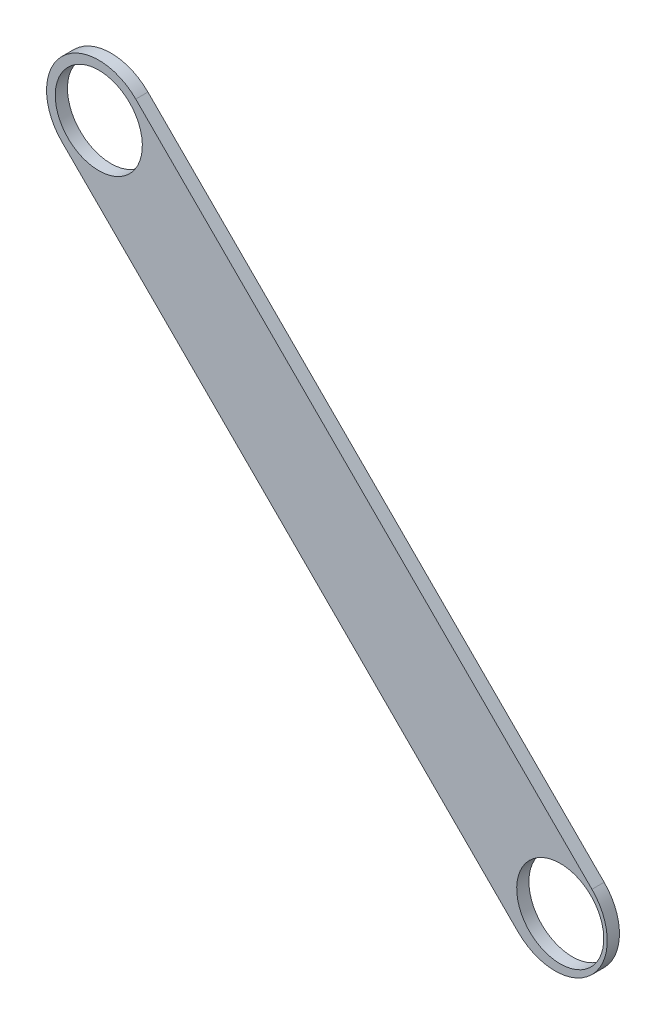
ISO-10303-21;
HEADER;
FILE_DESCRIPTION(('STEP AP214'),'2;1');
FILE_NAME('part.step','',(''),(''),'','','');
FILE_SCHEMA(('AUTOMOTIVE_DESIGN { 1 0 10303 214 1 1 1 1 }'));
ENDSEC;
DATA;
#1=APPLICATION_CONTEXT('core data for automotive mechanical design processes');
#2=APPLICATION_PROTOCOL_DEFINITION('international standard','automotive_design',2000,#1);
#3=PRODUCT_CONTEXT('',#1,'mechanical');
#4=PRODUCT('Part','Part','',(#3));
#5=PRODUCT_RELATED_PRODUCT_CATEGORY('part','',(#4));
#6=PRODUCT_DEFINITION_FORMATION('','',#4);
#7=PRODUCT_DEFINITION_CONTEXT('part definition',#1,'design');
#8=PRODUCT_DEFINITION('design','',#6,#7);
#9=PRODUCT_DEFINITION_SHAPE('','',#8);
#10=(LENGTH_UNIT() NAMED_UNIT(*) SI_UNIT(.MILLI.,.METRE.));
#11=(NAMED_UNIT(*) PLANE_ANGLE_UNIT() SI_UNIT($,.RADIAN.));
#12=(NAMED_UNIT(*) SI_UNIT($,.STERADIAN.) SOLID_ANGLE_UNIT());
#13=UNCERTAINTY_MEASURE_WITH_UNIT(LENGTH_MEASURE(1.E-05),#10,'distance_accuracy_value','');
#14=(GEOMETRIC_REPRESENTATION_CONTEXT(3) GLOBAL_UNCERTAINTY_ASSIGNED_CONTEXT((#13)) GLOBAL_UNIT_ASSIGNED_CONTEXT((#10,
#11,#12)) REPRESENTATION_CONTEXT('',''));
#15=CARTESIAN_POINT('',(0.,0.,0.));
#16=DIRECTION('',(0.,0.,1.));
#17=DIRECTION('',(1.,0.,0.));
#18=AXIS2_PLACEMENT_3D('',#15,#16,#17);
#19=CARTESIAN_POINT('',(89.575,-131.37,-0.045));
#20=DIRECTION('',(0.,0.,-1.));
#21=DIRECTION('',(0.,-1.,0.));
#22=AXIS2_PLACEMENT_3D('',#19,#20,#21);
#23=CYLINDRICAL_SURFACE('',#22,0.125);
#24=CARTESIAN_POINT('',(89.575,-131.37,-0.035));
#25=DIRECTION('',(0.,0.,-1.));
#26=DIRECTION('',(0.,-1.,0.));
#27=AXIS2_PLACEMENT_3D('',#24,#25,#26);
#28=CIRCLE('',#27,0.125);
#29=CARTESIAN_POINT('',(89.575,-131.495,-0.035));
#30=VERTEX_POINT('',#29);
#31=EDGE_CURVE('E128',#30,#30,#28,.T.);
#32=ORIENTED_EDGE('',*,*,#31,.T.);
#33=DIRECTION('',(0.,0.,1.));
#34=VECTOR('',#33,1.);
#35=CARTESIAN_POINT('',(89.575,-131.495,-0.045));
#36=LINE('',#35,#34);
#37=CARTESIAN_POINT('',(89.575,-131.495,0.));
#38=VERTEX_POINT('',#37);
#39=EDGE_CURVE('E11',#30,#38,#36,.T.);
#40=ORIENTED_EDGE('',*,*,#39,.T.);
#41=CARTESIAN_POINT('',(89.575,-131.37,0.));
#42=DIRECTION('',(0.,0.,-1.));
#43=DIRECTION('',(0.,-1.,0.));
#44=AXIS2_PLACEMENT_3D('',#41,#42,#43);
#45=CIRCLE('',#44,0.125);
#46=EDGE_CURVE('E141',#38,#38,#45,.T.);
#47=ORIENTED_EDGE('',*,*,#46,.F.);
#48=ORIENTED_EDGE('',*,*,#39,.F.);
#49=EDGE_LOOP('',(#32,#40,#47,#48));
#50=FACE_BOUND('',#49,.T.);
#51=ADVANCED_FACE('F17',(#50),#23,.F.);
#52=CARTESIAN_POINT('',(90.9,-132.68,-0.045));
#53=DIRECTION('',(0.,0.,-1.));
#54=DIRECTION('',(0.,-1.,0.));
#55=AXIS2_PLACEMENT_3D('',#52,#53,#54);
#56=CYLINDRICAL_SURFACE('',#55,0.125);
#57=CARTESIAN_POINT('',(90.9,-132.68,-0.035));
#58=DIRECTION('',(0.,0.,-1.));
#59=DIRECTION('',(0.,-1.,0.));
#60=AXIS2_PLACEMENT_3D('',#57,#58,#59);
#61=CIRCLE('',#60,0.125);
#62=CARTESIAN_POINT('',(90.9,-132.805,-0.035));
#63=VERTEX_POINT('',#62);
#64=EDGE_CURVE('E145',#63,#63,#61,.T.);
#65=ORIENTED_EDGE('',*,*,#64,.T.);
#66=DIRECTION('',(0.,0.,1.));
#67=VECTOR('',#66,1.);
#68=CARTESIAN_POINT('',(90.9,-132.805,-0.045));
#69=LINE('',#68,#67);
#70=CARTESIAN_POINT('',(90.9,-132.805,0.));
#71=VERTEX_POINT('',#70);
#72=EDGE_CURVE('E25',#63,#71,#69,.T.);
#73=ORIENTED_EDGE('',*,*,#72,.T.);
#74=CARTESIAN_POINT('',(90.9,-132.68,0.));
#75=DIRECTION('',(0.,0.,-1.));
#76=DIRECTION('',(0.,-1.,0.));
#77=AXIS2_PLACEMENT_3D('',#74,#75,#76);
#78=CIRCLE('',#77,0.125);
#79=EDGE_CURVE('E127',#71,#71,#78,.T.);
#80=ORIENTED_EDGE('',*,*,#79,.F.);
#81=ORIENTED_EDGE('',*,*,#72,.F.);
#82=EDGE_LOOP('',(#65,#73,#80,#81));
#83=FACE_BOUND('',#82,.T.);
#84=ADVANCED_FACE('F220',(#83),#56,.F.);
#85=CARTESIAN_POINT('',(89.468933,-131.476066,-0.035));
#86=DIRECTION('',(0.707106781186548,0.707106781186548,0.));
#87=DIRECTION('',(0.,0.,-1.));
#88=AXIS2_PLACEMENT_3D('',#85,#86,#87);
#89=PLANE('',#88);
#90=DIRECTION('',(0.707106781186548,-0.707106781186548,0.));
#91=VECTOR('',#90,1.);
#92=CARTESIAN_POINT('',(89.468933,-131.476066,-0.035));
#93=LINE('',#92,#91);
#94=CARTESIAN_POINT('',(89.468933,-131.476066,-0.035));
#95=VERTEX_POINT('',#94);
#96=CARTESIAN_POINT('',(90.778933,-132.786066,-0.035));
#97=VERTEX_POINT('',#96);
#98=EDGE_CURVE('E148',#95,#97,#93,.T.);
#99=ORIENTED_EDGE('',*,*,#98,.T.);
#100=DIRECTION('',(0.,0.,1.));
#101=VECTOR('',#100,1.);
#102=CARTESIAN_POINT('',(90.778933,-132.786066,-0.035));
#103=LINE('',#102,#101);
#104=CARTESIAN_POINT('',(90.778933,-132.786066,0.));
#105=VERTEX_POINT('',#104);
#106=EDGE_CURVE('E95',#97,#105,#103,.T.);
#107=ORIENTED_EDGE('',*,*,#106,.T.);
#108=DIRECTION('',(0.707106781186548,-0.707106781186548,0.));
#109=VECTOR('',#108,1.);
#110=CARTESIAN_POINT('',(89.468933,-131.476066,0.));
#111=LINE('',#110,#109);
#112=CARTESIAN_POINT('',(89.468933,-131.476066,0.));
#113=VERTEX_POINT('',#112);
#114=EDGE_CURVE('E125',#113,#105,#111,.T.);
#115=ORIENTED_EDGE('',*,*,#114,.F.);
#116=DIRECTION('',(0.,0.,1.));
#117=VECTOR('',#116,1.);
#118=CARTESIAN_POINT('',(89.468933,-131.476066,-0.035));
#119=LINE('',#118,#117);
#120=EDGE_CURVE('E136',#95,#113,#119,.T.);
#121=ORIENTED_EDGE('',*,*,#120,.F.);
#122=EDGE_LOOP('',(#99,#107,#115,#121));
#123=FACE_BOUND('',#122,.T.);
#124=ADVANCED_FACE('F218',(#123),#89,.F.);
#125=CARTESIAN_POINT('',(90.991066,-132.573933,0.));
#126=DIRECTION('',(0.,0.,1.));
#127=DIRECTION('',(1.,0.,0.));
#128=AXIS2_PLACEMENT_3D('',#125,#126,#127);
#129=PLANE('',#128);
#130=ORIENTED_EDGE('',*,*,#46,.T.);
#131=EDGE_LOOP('',(#130));
#132=FACE_BOUND('',#131,.T.);
#133=ORIENTED_EDGE('',*,*,#79,.T.);
#134=EDGE_LOOP('',(#133));
#135=FACE_BOUND('',#134,.T.);
#136=DIRECTION('',(-0.707106781186548,0.707106781186548,0.));
#137=VECTOR('',#136,1.);
#138=CARTESIAN_POINT('',(90.991066,-132.573933,0.));
#139=LINE('',#138,#137);
#140=CARTESIAN_POINT('',(90.991066,-132.573933,0.));
#141=VERTEX_POINT('',#140);
#142=CARTESIAN_POINT('',(89.681066,-131.263933,0.));
#143=VERTEX_POINT('',#142);
#144=EDGE_CURVE('E107',#141,#143,#139,.T.);
#145=ORIENTED_EDGE('',*,*,#144,.T.);
#146=CARTESIAN_POINT('',(89.5749995,-131.3699995,0.));
#147=DIRECTION('',(0.,0.,1.));
#148=DIRECTION('',(0.707106781186548,0.707106781186548,0.));
#149=AXIS2_PLACEMENT_3D('',#146,#147,#148);
#150=CIRCLE('',#149,0.150000682813);
#151=EDGE_CURVE('E124',#143,#113,#150,.T.);
#152=ORIENTED_EDGE('',*,*,#151,.T.);
#153=ORIENTED_EDGE('',*,*,#114,.T.);
#154=CARTESIAN_POINT('',(90.8849995,-132.6799995,0.));
#155=DIRECTION('',(0.,0.,1.));
#156=DIRECTION('',(-0.707106781186548,-0.707106781186548,0.));
#157=AXIS2_PLACEMENT_3D('',#154,#155,#156);
#158=CIRCLE('',#157,0.150000682813);
#159=EDGE_CURVE('E99',#105,#141,#158,.T.);
#160=ORIENTED_EDGE('',*,*,#159,.T.);
#161=EDGE_LOOP('',(#145,#152,#153,#160));
#162=FACE_BOUND('',#161,.T.);
#163=ADVANCED_FACE('F213',(#132,#135,#162),#129,.T.);
#164=CARTESIAN_POINT('',(90.991066,-132.573933,-0.035));
#165=DIRECTION('',(0.,0.,1.));
#166=DIRECTION('',(1.,0.,0.));
#167=AXIS2_PLACEMENT_3D('',#164,#165,#166);
#168=PLANE('',#167);
#169=ORIENTED_EDGE('',*,*,#31,.F.);
#170=EDGE_LOOP('',(#169));
#171=FACE_BOUND('',#170,.T.);
#172=ORIENTED_EDGE('',*,*,#64,.F.);
#173=EDGE_LOOP('',(#172));
#174=FACE_BOUND('',#173,.T.);
#175=CARTESIAN_POINT('',(90.8849995,-132.6799995,-0.035));
#176=DIRECTION('',(0.,0.,1.));
#177=DIRECTION('',(-0.707106781186548,-0.707106781186548,0.));
#178=AXIS2_PLACEMENT_3D('',#175,#176,#177);
#179=CIRCLE('',#178,0.150000682813);
#180=CARTESIAN_POINT('',(90.991066,-132.573933,-0.035));
#181=VERTEX_POINT('',#180);
#182=EDGE_CURVE('E88',#97,#181,#179,.T.);
#183=ORIENTED_EDGE('',*,*,#182,.F.);
#184=ORIENTED_EDGE('',*,*,#98,.F.);
#185=CARTESIAN_POINT('',(89.5749995,-131.3699995,-0.035));
#186=DIRECTION('',(0.,0.,1.));
#187=DIRECTION('',(0.707106781186548,0.707106781186548,0.));
#188=AXIS2_PLACEMENT_3D('',#185,#186,#187);
#189=CIRCLE('',#188,0.150000682813);
#190=CARTESIAN_POINT('',(89.681066,-131.263933,-0.035));
#191=VERTEX_POINT('',#190);
#192=EDGE_CURVE('E112',#191,#95,#189,.T.);
#193=ORIENTED_EDGE('',*,*,#192,.F.);
#194=DIRECTION('',(-0.707106781186548,0.707106781186548,0.));
#195=VECTOR('',#194,1.);
#196=CARTESIAN_POINT('',(90.991066,-132.573933,-0.035));
#197=LINE('',#196,#195);
#198=EDGE_CURVE('E105',#181,#191,#197,.T.);
#199=ORIENTED_EDGE('',*,*,#198,.F.);
#200=EDGE_LOOP('',(#183,#184,#193,#199));
#201=FACE_BOUND('',#200,.T.);
#202=ADVANCED_FACE('F110',(#171,#174,#201),#168,.F.);
#203=CARTESIAN_POINT('',(89.5749995,-131.3699995,-0.035));
#204=DIRECTION('',(0.,0.,-1.));
#205=DIRECTION('',(0.707106781186548,0.707106781186548,0.));
#206=AXIS2_PLACEMENT_3D('',#203,#204,#205);
#207=CYLINDRICAL_SURFACE('',#206,0.150000682813);
#208=ORIENTED_EDGE('',*,*,#192,.T.);
#209=ORIENTED_EDGE('',*,*,#120,.T.);
#210=ORIENTED_EDGE('',*,*,#151,.F.);
#211=DIRECTION('',(0.,0.,1.));
#212=VECTOR('',#211,1.);
#213=CARTESIAN_POINT('',(89.681066,-131.263933,-0.035));
#214=LINE('',#213,#212);
#215=EDGE_CURVE('E115',#191,#143,#214,.T.);
#216=ORIENTED_EDGE('',*,*,#215,.F.);
#217=EDGE_LOOP('',(#208,#209,#210,#216));
#218=FACE_BOUND('',#217,.T.);
#219=ADVANCED_FACE('F216',(#218),#207,.T.);
#220=CARTESIAN_POINT('',(90.8849995,-132.6799995,-0.035));
#221=DIRECTION('',(0.,0.,-1.));
#222=DIRECTION('',(-0.707106781186548,-0.707106781186548,0.));
#223=AXIS2_PLACEMENT_3D('',#220,#221,#222);
#224=CYLINDRICAL_SURFACE('',#223,0.150000682813);
#225=ORIENTED_EDGE('',*,*,#182,.T.);
#226=DIRECTION('',(0.,0.,1.));
#227=VECTOR('',#226,1.);
#228=CARTESIAN_POINT('',(90.991066,-132.573933,-0.035));
#229=LINE('',#228,#227);
#230=EDGE_CURVE('E92',#181,#141,#229,.T.);
#231=ORIENTED_EDGE('',*,*,#230,.T.);
#232=ORIENTED_EDGE('',*,*,#159,.F.);
#233=ORIENTED_EDGE('',*,*,#106,.F.);
#234=EDGE_LOOP('',(#225,#231,#232,#233));
#235=FACE_BOUND('',#234,.T.);
#236=ADVANCED_FACE('F90',(#235),#224,.T.);
#237=CARTESIAN_POINT('',(90.991066,-132.573933,-0.035));
#238=DIRECTION('',(-0.707106781186548,-0.707106781186548,0.));
#239=DIRECTION('',(-0.707106781186548,0.707106781186548,0.));
#240=AXIS2_PLACEMENT_3D('',#237,#238,#239);
#241=PLANE('',#240);
#242=ORIENTED_EDGE('',*,*,#198,.T.);
#243=ORIENTED_EDGE('',*,*,#215,.T.);
#244=ORIENTED_EDGE('',*,*,#144,.F.);
#245=ORIENTED_EDGE('',*,*,#230,.F.);
#246=EDGE_LOOP('',(#242,#243,#244,#245));
#247=FACE_BOUND('',#246,.T.);
#248=ADVANCED_FACE('F103',(#247),#241,.F.);
#249=CLOSED_SHELL('',(#51,#84,#124,#163,#202,#219,#236,#248));
#250=MANIFOLD_SOLID_BREP('B1',#249);
#251=ADVANCED_BREP_SHAPE_REPRESENTATION('',(#18,#250),#14);
#252=SHAPE_DEFINITION_REPRESENTATION(#9,#251);
ENDSEC;
END-ISO-10303-21;
